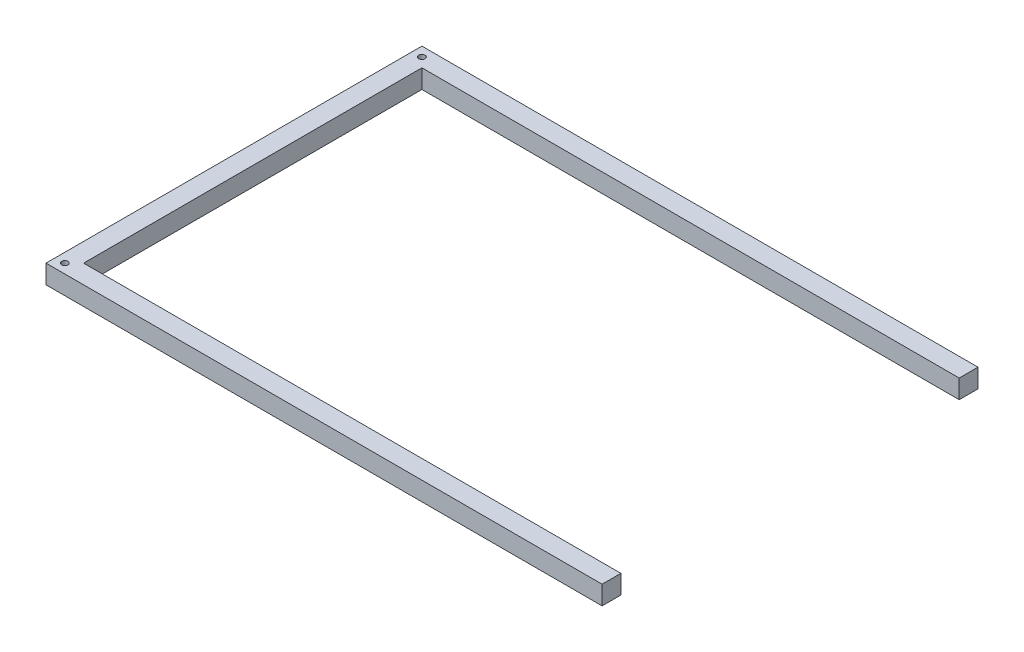
ISO-10303-21;
HEADER;
FILE_DESCRIPTION(('STEP AP214'),'2;1');
FILE_NAME('part.step','',(''),(''),'','','');
FILE_SCHEMA(('AUTOMOTIVE_DESIGN { 1 0 10303 214 1 1 1 1 }'));
ENDSEC;
DATA;
#1=APPLICATION_CONTEXT('core data for automotive mechanical design processes');
#2=APPLICATION_PROTOCOL_DEFINITION('international standard','automotive_design',2000,#1);
#3=PRODUCT_CONTEXT('',#1,'mechanical');
#4=PRODUCT('Part','Part','',(#3));
#5=PRODUCT_RELATED_PRODUCT_CATEGORY('part','',(#4));
#6=PRODUCT_DEFINITION_FORMATION('','',#4);
#7=PRODUCT_DEFINITION_CONTEXT('part definition',#1,'design');
#8=PRODUCT_DEFINITION('design','',#6,#7);
#9=PRODUCT_DEFINITION_SHAPE('','',#8);
#10=(LENGTH_UNIT() NAMED_UNIT(*) SI_UNIT(.MILLI.,.METRE.));
#11=(NAMED_UNIT(*) PLANE_ANGLE_UNIT() SI_UNIT($,.RADIAN.));
#12=(NAMED_UNIT(*) SI_UNIT($,.STERADIAN.) SOLID_ANGLE_UNIT());
#13=UNCERTAINTY_MEASURE_WITH_UNIT(LENGTH_MEASURE(1.E-05),#10,'distance_accuracy_value','');
#14=(GEOMETRIC_REPRESENTATION_CONTEXT(3) GLOBAL_UNCERTAINTY_ASSIGNED_CONTEXT((#13)) GLOBAL_UNIT_ASSIGNED_CONTEXT((#10,
#11,#12)) REPRESENTATION_CONTEXT('',''));
#15=CARTESIAN_POINT('',(0.,0.,0.));
#16=DIRECTION('',(0.,0.,1.));
#17=DIRECTION('',(1.,0.,0.));
#18=AXIS2_PLACEMENT_3D('',#15,#16,#17);
#19=CARTESIAN_POINT('',(0.,3.,0.));
#20=DIRECTION('',(0.,1.,0.));
#21=DIRECTION('',(0.,0.,1.));
#22=AXIS2_PLACEMENT_3D('',#19,#20,#21);
#23=PLANE('',#22);
#24=CARTESIAN_POINT('',(-44.3625,3.,-28.4875));
#25=DIRECTION('',(0.,1.,0.));
#26=DIRECTION('',(0.,0.,1.));
#27=AXIS2_PLACEMENT_3D('',#24,#25,#26);
#28=CIRCLE('',#27,0.499999999999999);
#29=CARTESIAN_POINT('',(-44.3625,3.,-27.9875));
#30=VERTEX_POINT('',#29);
#31=EDGE_CURVE('E133',#30,#30,#28,.T.);
#32=ORIENTED_EDGE('',*,*,#31,.F.);
#33=EDGE_LOOP('',(#32));
#34=FACE_BOUND('',#33,.T.);
#35=DIRECTION('',(1.,0.,0.));
#36=VECTOR('',#35,1.);
#37=CARTESIAN_POINT('',(-42.8625,3.,-26.9875));
#38=LINE('',#37,#36);
#39=CARTESIAN_POINT('',(-42.8625,3.,-26.9875));
#40=VERTEX_POINT('',#39);
#41=CARTESIAN_POINT('',(42.8625,3.,-26.9875));
#42=VERTEX_POINT('',#41);
#43=EDGE_CURVE('E144',#40,#42,#38,.T.);
#44=ORIENTED_EDGE('',*,*,#43,.T.);
#45=DIRECTION('',(0.,0.,-1.));
#46=VECTOR('',#45,1.);
#47=CARTESIAN_POINT('',(42.8625,3.,-26.9875));
#48=LINE('',#47,#46);
#49=CARTESIAN_POINT('',(42.8625,3.,-29.9875));
#50=VERTEX_POINT('',#49);
#51=EDGE_CURVE('E92',#42,#50,#48,.T.);
#52=ORIENTED_EDGE('',*,*,#51,.T.);
#53=DIRECTION('',(-1.,0.,0.));
#54=VECTOR('',#53,1.);
#55=CARTESIAN_POINT('',(42.8625,3.,-29.9875));
#56=LINE('',#55,#54);
#57=CARTESIAN_POINT('',(-45.8625,3.,-29.9875));
#58=VERTEX_POINT('',#57);
#59=EDGE_CURVE('E159',#50,#58,#56,.T.);
#60=ORIENTED_EDGE('',*,*,#59,.T.);
#61=DIRECTION('',(0.,0.,1.));
#62=VECTOR('',#61,1.);
#63=CARTESIAN_POINT('',(-45.8625,3.,-29.9875));
#64=LINE('',#63,#62);
#65=CARTESIAN_POINT('',(-45.8625,3.,29.9875));
#66=VERTEX_POINT('',#65);
#67=EDGE_CURVE('E172',#58,#66,#64,.T.);
#68=ORIENTED_EDGE('',*,*,#67,.T.);
#69=DIRECTION('',(1.,0.,0.));
#70=VECTOR('',#69,1.);
#71=CARTESIAN_POINT('',(-45.8625,3.,29.9875));
#72=LINE('',#71,#70);
#73=CARTESIAN_POINT('',(42.8625,3.,29.9875));
#74=VERTEX_POINT('',#73);
#75=EDGE_CURVE('E111',#66,#74,#72,.T.);
#76=ORIENTED_EDGE('',*,*,#75,.T.);
#77=DIRECTION('',(0.,0.,-1.));
#78=VECTOR('',#77,1.);
#79=CARTESIAN_POINT('',(42.8625,3.,29.9875));
#80=LINE('',#79,#78);
#81=CARTESIAN_POINT('',(42.8625,3.,26.9875));
#82=VERTEX_POINT('',#81);
#83=EDGE_CURVE('E105',#74,#82,#80,.T.);
#84=ORIENTED_EDGE('',*,*,#83,.T.);
#85=DIRECTION('',(-1.,0.,0.));
#86=VECTOR('',#85,1.);
#87=CARTESIAN_POINT('',(-42.8625,3.,26.9875));
#88=LINE('',#87,#86);
#89=CARTESIAN_POINT('',(-42.8625,3.,26.9875));
#90=VERTEX_POINT('',#89);
#91=EDGE_CURVE('E109',#82,#90,#88,.T.);
#92=ORIENTED_EDGE('',*,*,#91,.T.);
#93=DIRECTION('',(0.,0.,-1.));
#94=VECTOR('',#93,1.);
#95=CARTESIAN_POINT('',(-42.8625,3.,26.9875));
#96=LINE('',#95,#94);
#97=EDGE_CURVE('E49',#90,#40,#96,.T.);
#98=ORIENTED_EDGE('',*,*,#97,.T.);
#99=EDGE_LOOP('',(#44,#52,#60,#68,#76,#84,#92,#98));
#100=FACE_BOUND('',#99,.T.);
#101=CARTESIAN_POINT('',(-44.3625,3.,28.4875));
#102=DIRECTION('',(0.,1.,0.));
#103=DIRECTION('',(0.,0.,1.));
#104=AXIS2_PLACEMENT_3D('',#101,#102,#103);
#105=CIRCLE('',#104,0.499999999999999);
#106=CARTESIAN_POINT('',(-44.3625,3.,28.9875));
#107=VERTEX_POINT('',#106);
#108=EDGE_CURVE('E181',#107,#107,#105,.T.);
#109=ORIENTED_EDGE('',*,*,#108,.F.);
#110=EDGE_LOOP('',(#109));
#111=FACE_BOUND('',#110,.T.);
#112=ADVANCED_FACE('F32',(#34,#100,#111),#23,.T.);
#113=CARTESIAN_POINT('',(0.,0.,0.));
#114=DIRECTION('',(0.,1.,0.));
#115=DIRECTION('',(0.,0.,1.));
#116=AXIS2_PLACEMENT_3D('',#113,#114,#115);
#117=PLANE('',#116);
#118=DIRECTION('',(1.,0.,0.));
#119=VECTOR('',#118,1.);
#120=CARTESIAN_POINT('',(-42.8625,0.,-26.9875));
#121=LINE('',#120,#119);
#122=CARTESIAN_POINT('',(-42.8625,0.,-26.9875));
#123=VERTEX_POINT('',#122);
#124=CARTESIAN_POINT('',(42.8625,0.,-26.9875));
#125=VERTEX_POINT('',#124);
#126=EDGE_CURVE('E129',#123,#125,#121,.T.);
#127=ORIENTED_EDGE('',*,*,#126,.F.);
#128=DIRECTION('',(0.,0.,-1.));
#129=VECTOR('',#128,1.);
#130=CARTESIAN_POINT('',(-42.8625,0.,26.9875));
#131=LINE('',#130,#129);
#132=CARTESIAN_POINT('',(-42.8625,0.,26.9875));
#133=VERTEX_POINT('',#132);
#134=EDGE_CURVE('E84',#133,#123,#131,.T.);
#135=ORIENTED_EDGE('',*,*,#134,.F.);
#136=DIRECTION('',(-1.,0.,0.));
#137=VECTOR('',#136,1.);
#138=CARTESIAN_POINT('',(-42.8625,0.,26.9875));
#139=LINE('',#138,#137);
#140=CARTESIAN_POINT('',(42.8625,0.,26.9875));
#141=VERTEX_POINT('',#140);
#142=EDGE_CURVE('E78',#141,#133,#139,.T.);
#143=ORIENTED_EDGE('',*,*,#142,.F.);
#144=DIRECTION('',(0.,0.,-1.));
#145=VECTOR('',#144,1.);
#146=CARTESIAN_POINT('',(42.8625,0.,29.9875));
#147=LINE('',#146,#145);
#148=CARTESIAN_POINT('',(42.8625,0.,29.9875));
#149=VERTEX_POINT('',#148);
#150=EDGE_CURVE('E119',#149,#141,#147,.T.);
#151=ORIENTED_EDGE('',*,*,#150,.F.);
#152=DIRECTION('',(1.,0.,0.));
#153=VECTOR('',#152,1.);
#154=CARTESIAN_POINT('',(-45.8625,0.,29.9875));
#155=LINE('',#154,#153);
#156=CARTESIAN_POINT('',(-45.8625,0.,29.9875));
#157=VERTEX_POINT('',#156);
#158=EDGE_CURVE('E139',#157,#149,#155,.T.);
#159=ORIENTED_EDGE('',*,*,#158,.F.);
#160=DIRECTION('',(0.,0.,1.));
#161=VECTOR('',#160,1.);
#162=CARTESIAN_POINT('',(-45.8625,0.,-29.9875));
#163=LINE('',#162,#161);
#164=CARTESIAN_POINT('',(-45.8625,0.,-29.9875));
#165=VERTEX_POINT('',#164);
#166=EDGE_CURVE('E137',#165,#157,#163,.T.);
#167=ORIENTED_EDGE('',*,*,#166,.F.);
#168=DIRECTION('',(-1.,0.,0.));
#169=VECTOR('',#168,1.);
#170=CARTESIAN_POINT('',(42.8625,0.,-29.9875));
#171=LINE('',#170,#169);
#172=CARTESIAN_POINT('',(42.8625,0.,-29.9875));
#173=VERTEX_POINT('',#172);
#174=EDGE_CURVE('E135',#173,#165,#171,.T.);
#175=ORIENTED_EDGE('',*,*,#174,.F.);
#176=DIRECTION('',(0.,0.,-1.));
#177=VECTOR('',#176,1.);
#178=CARTESIAN_POINT('',(42.8625,0.,-26.9875));
#179=LINE('',#178,#177);
#180=EDGE_CURVE('E132',#125,#173,#179,.T.);
#181=ORIENTED_EDGE('',*,*,#180,.F.);
#182=EDGE_LOOP('',(#127,#135,#143,#151,#159,#167,#175,#181));
#183=FACE_BOUND('',#182,.T.);
#184=CARTESIAN_POINT('',(-44.3625,0.,-28.4875));
#185=DIRECTION('',(0.,1.,0.));
#186=DIRECTION('',(0.,0.,1.));
#187=AXIS2_PLACEMENT_3D('',#184,#185,#186);
#188=CIRCLE('',#187,0.499999999999999);
#189=CARTESIAN_POINT('',(-44.3625,0.,-27.9875));
#190=VERTEX_POINT('',#189);
#191=EDGE_CURVE('E178',#190,#190,#188,.T.);
#192=ORIENTED_EDGE('',*,*,#191,.T.);
#193=EDGE_LOOP('',(#192));
#194=FACE_BOUND('',#193,.T.);
#195=CARTESIAN_POINT('',(-44.3625,0.,28.4875));
#196=DIRECTION('',(0.,1.,0.));
#197=DIRECTION('',(0.,0.,1.));
#198=AXIS2_PLACEMENT_3D('',#195,#196,#197);
#199=CIRCLE('',#198,0.499999999999999);
#200=CARTESIAN_POINT('',(-44.3625,0.,28.9875));
#201=VERTEX_POINT('',#200);
#202=EDGE_CURVE('E184',#201,#201,#199,.T.);
#203=ORIENTED_EDGE('',*,*,#202,.T.);
#204=EDGE_LOOP('',(#203));
#205=FACE_BOUND('',#204,.T.);
#206=ADVANCED_FACE('F163',(#183,#194,#205),#117,.F.);
#207=CARTESIAN_POINT('',(-42.8625,3.,-26.9875));
#208=DIRECTION('',(0.,0.,-1.));
#209=DIRECTION('',(-1.,0.,0.));
#210=AXIS2_PLACEMENT_3D('',#207,#208,#209);
#211=PLANE('',#210);
#212=ORIENTED_EDGE('',*,*,#126,.T.);
#213=DIRECTION('',(0.,-1.,0.));
#214=VECTOR('',#213,1.);
#215=CARTESIAN_POINT('',(42.8625,3.,-26.9875));
#216=LINE('',#215,#214);
#217=EDGE_CURVE('E11',#42,#125,#216,.T.);
#218=ORIENTED_EDGE('',*,*,#217,.F.);
#219=ORIENTED_EDGE('',*,*,#43,.F.);
#220=DIRECTION('',(0.,-1.,0.));
#221=VECTOR('',#220,1.);
#222=CARTESIAN_POINT('',(-42.8625,3.,-26.9875));
#223=LINE('',#222,#221);
#224=EDGE_CURVE('E125',#40,#123,#223,.T.);
#225=ORIENTED_EDGE('',*,*,#224,.T.);
#226=EDGE_LOOP('',(#212,#218,#219,#225));
#227=FACE_BOUND('',#226,.T.);
#228=ADVANCED_FACE('F34',(#227),#211,.F.);
#229=CARTESIAN_POINT('',(42.8625,3.,-26.9875));
#230=DIRECTION('',(-1.,0.,0.));
#231=DIRECTION('',(0.,0.,1.));
#232=AXIS2_PLACEMENT_3D('',#229,#230,#231);
#233=PLANE('',#232);
#234=ORIENTED_EDGE('',*,*,#180,.T.);
#235=DIRECTION('',(0.,-1.,0.));
#236=VECTOR('',#235,1.);
#237=CARTESIAN_POINT('',(42.8625,3.,-29.9875));
#238=LINE('',#237,#236);
#239=EDGE_CURVE('E41',#50,#173,#238,.T.);
#240=ORIENTED_EDGE('',*,*,#239,.F.);
#241=ORIENTED_EDGE('',*,*,#51,.F.);
#242=ORIENTED_EDGE('',*,*,#217,.T.);
#243=EDGE_LOOP('',(#234,#240,#241,#242));
#244=FACE_BOUND('',#243,.T.);
#245=ADVANCED_FACE('F216',(#244),#233,.F.);
#246=CARTESIAN_POINT('',(42.8625,3.,-29.9875));
#247=DIRECTION('',(0.,0.,1.));
#248=DIRECTION('',(1.,0.,0.));
#249=AXIS2_PLACEMENT_3D('',#246,#247,#248);
#250=PLANE('',#249);
#251=ORIENTED_EDGE('',*,*,#174,.T.);
#252=DIRECTION('',(0.,-1.,0.));
#253=VECTOR('',#252,1.);
#254=CARTESIAN_POINT('',(-45.8625,3.,-29.9875));
#255=LINE('',#254,#253);
#256=EDGE_CURVE('E151',#58,#165,#255,.T.);
#257=ORIENTED_EDGE('',*,*,#256,.F.);
#258=ORIENTED_EDGE('',*,*,#59,.F.);
#259=ORIENTED_EDGE('',*,*,#239,.T.);
#260=EDGE_LOOP('',(#251,#257,#258,#259));
#261=FACE_BOUND('',#260,.T.);
#262=ADVANCED_FACE('F157',(#261),#250,.F.);
#263=CARTESIAN_POINT('',(-45.8625,3.,-29.9875));
#264=DIRECTION('',(1.,0.,0.));
#265=DIRECTION('',(0.,0.,-1.));
#266=AXIS2_PLACEMENT_3D('',#263,#264,#265);
#267=PLANE('',#266);
#268=ORIENTED_EDGE('',*,*,#166,.T.);
#269=DIRECTION('',(0.,-1.,0.));
#270=VECTOR('',#269,1.);
#271=CARTESIAN_POINT('',(-45.8625,3.,29.9875));
#272=LINE('',#271,#270);
#273=EDGE_CURVE('E148',#66,#157,#272,.T.);
#274=ORIENTED_EDGE('',*,*,#273,.F.);
#275=ORIENTED_EDGE('',*,*,#67,.F.);
#276=ORIENTED_EDGE('',*,*,#256,.T.);
#277=EDGE_LOOP('',(#268,#274,#275,#276));
#278=FACE_BOUND('',#277,.T.);
#279=ADVANCED_FACE('F168',(#278),#267,.F.);
#280=CARTESIAN_POINT('',(-45.8625,3.,29.9875));
#281=DIRECTION('',(0.,0.,-1.));
#282=DIRECTION('',(-1.,0.,0.));
#283=AXIS2_PLACEMENT_3D('',#280,#281,#282);
#284=PLANE('',#283);
#285=ORIENTED_EDGE('',*,*,#158,.T.);
#286=DIRECTION('',(0.,-1.,0.));
#287=VECTOR('',#286,1.);
#288=CARTESIAN_POINT('',(42.8625,3.,29.9875));
#289=LINE('',#288,#287);
#290=EDGE_CURVE('E120',#74,#149,#289,.T.);
#291=ORIENTED_EDGE('',*,*,#290,.F.);
#292=ORIENTED_EDGE('',*,*,#75,.F.);
#293=ORIENTED_EDGE('',*,*,#273,.T.);
#294=EDGE_LOOP('',(#285,#291,#292,#293));
#295=FACE_BOUND('',#294,.T.);
#296=ADVANCED_FACE('F171',(#295),#284,.F.);
#297=CARTESIAN_POINT('',(42.8625,3.,29.9875));
#298=DIRECTION('',(-1.,0.,0.));
#299=DIRECTION('',(0.,0.,1.));
#300=AXIS2_PLACEMENT_3D('',#297,#298,#299);
#301=PLANE('',#300);
#302=ORIENTED_EDGE('',*,*,#150,.T.);
#303=DIRECTION('',(0.,-1.,0.));
#304=VECTOR('',#303,1.);
#305=CARTESIAN_POINT('',(42.8625,3.,26.9875));
#306=LINE('',#305,#304);
#307=EDGE_CURVE('E116',#82,#141,#306,.T.);
#308=ORIENTED_EDGE('',*,*,#307,.F.);
#309=ORIENTED_EDGE('',*,*,#83,.F.);
#310=ORIENTED_EDGE('',*,*,#290,.T.);
#311=EDGE_LOOP('',(#302,#308,#309,#310));
#312=FACE_BOUND('',#311,.T.);
#313=ADVANCED_FACE('F117',(#312),#301,.F.);
#314=CARTESIAN_POINT('',(-42.8625,3.,26.9875));
#315=DIRECTION('',(0.,0.,1.));
#316=DIRECTION('',(1.,0.,0.));
#317=AXIS2_PLACEMENT_3D('',#314,#315,#316);
#318=PLANE('',#317);
#319=ORIENTED_EDGE('',*,*,#142,.T.);
#320=DIRECTION('',(0.,-1.,0.));
#321=VECTOR('',#320,1.);
#322=CARTESIAN_POINT('',(-42.8625,3.,26.9875));
#323=LINE('',#322,#321);
#324=EDGE_CURVE('E121',#90,#133,#323,.T.);
#325=ORIENTED_EDGE('',*,*,#324,.F.);
#326=ORIENTED_EDGE('',*,*,#91,.F.);
#327=ORIENTED_EDGE('',*,*,#307,.T.);
#328=EDGE_LOOP('',(#319,#325,#326,#327));
#329=FACE_BOUND('',#328,.T.);
#330=ADVANCED_FACE('F123',(#329),#318,.F.);
#331=CARTESIAN_POINT('',(-42.8625,3.,26.9875));
#332=DIRECTION('',(-1.,0.,0.));
#333=DIRECTION('',(0.,0.,1.));
#334=AXIS2_PLACEMENT_3D('',#331,#332,#333);
#335=PLANE('',#334);
#336=ORIENTED_EDGE('',*,*,#134,.T.);
#337=ORIENTED_EDGE('',*,*,#224,.F.);
#338=ORIENTED_EDGE('',*,*,#97,.F.);
#339=ORIENTED_EDGE('',*,*,#324,.T.);
#340=EDGE_LOOP('',(#336,#337,#338,#339));
#341=FACE_BOUND('',#340,.T.);
#342=ADVANCED_FACE('F204',(#341),#335,.F.);
#343=CARTESIAN_POINT('',(-44.3625,3.,-28.4875));
#344=DIRECTION('',(0.,-1.,0.));
#345=DIRECTION('',(0.,0.,-1.));
#346=AXIS2_PLACEMENT_3D('',#343,#344,#345);
#347=CYLINDRICAL_SURFACE('',#346,0.499999999999999);
#348=ORIENTED_EDGE('',*,*,#31,.T.);
#349=EDGE_LOOP('',(#348));
#350=FACE_BOUND('',#349,.T.);
#351=ORIENTED_EDGE('',*,*,#191,.F.);
#352=EDGE_LOOP('',(#351));
#353=FACE_BOUND('',#352,.T.);
#354=ADVANCED_FACE('F201',(#350,#353),#347,.F.);
#355=CARTESIAN_POINT('',(-44.3625,3.,28.4875));
#356=DIRECTION('',(0.,-1.,0.));
#357=DIRECTION('',(0.,0.,-1.));
#358=AXIS2_PLACEMENT_3D('',#355,#356,#357);
#359=CYLINDRICAL_SURFACE('',#358,0.499999999999999);
#360=ORIENTED_EDGE('',*,*,#108,.T.);
#361=EDGE_LOOP('',(#360));
#362=FACE_BOUND('',#361,.T.);
#363=ORIENTED_EDGE('',*,*,#202,.F.);
#364=EDGE_LOOP('',(#363));
#365=FACE_BOUND('',#364,.T.);
#366=ADVANCED_FACE('F190',(#362,#365),#359,.F.);
#367=CLOSED_SHELL('',(#112,#206,#228,#245,#262,#279,#296,#313,#330,#342,#354,#366));
#368=MANIFOLD_SOLID_BREP('B2',#367);
#369=ADVANCED_BREP_SHAPE_REPRESENTATION('',(#18,#368),#14);
#370=SHAPE_DEFINITION_REPRESENTATION(#9,#369);
ENDSEC;
END-ISO-10303-21;
